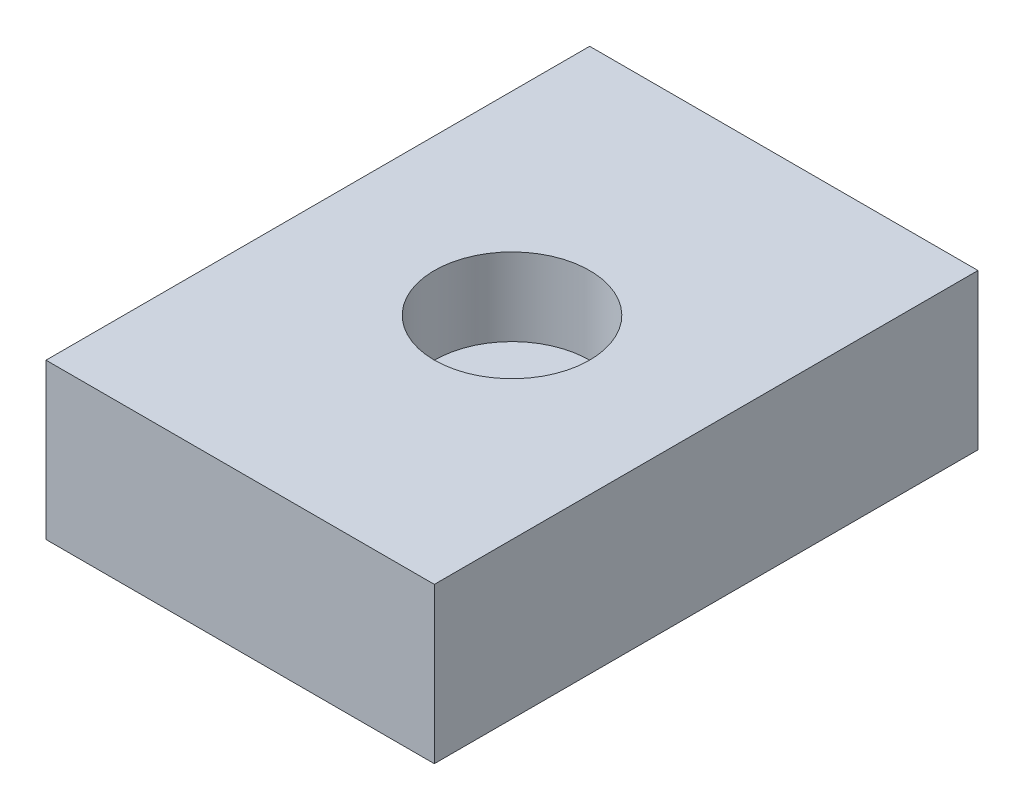
ISO-10303-21;
HEADER;
FILE_DESCRIPTION(('STEP AP214'),'2;1');
FILE_NAME('part.step','',(''),(''),'','','');
FILE_SCHEMA(('AUTOMOTIVE_DESIGN { 1 0 10303 214 1 1 1 1 }'));
ENDSEC;
DATA;
#1=APPLICATION_CONTEXT('core data for automotive mechanical design processes');
#2=APPLICATION_PROTOCOL_DEFINITION('international standard','automotive_design',2000,#1);
#3=PRODUCT_CONTEXT('',#1,'mechanical');
#4=PRODUCT('Part','Part','',(#3));
#5=PRODUCT_RELATED_PRODUCT_CATEGORY('part','',(#4));
#6=PRODUCT_DEFINITION_FORMATION('','',#4);
#7=PRODUCT_DEFINITION_CONTEXT('part definition',#1,'design');
#8=PRODUCT_DEFINITION('design','',#6,#7);
#9=PRODUCT_DEFINITION_SHAPE('','',#8);
#10=(LENGTH_UNIT() NAMED_UNIT(*) SI_UNIT(.MILLI.,.METRE.));
#11=(NAMED_UNIT(*) PLANE_ANGLE_UNIT() SI_UNIT($,.RADIAN.));
#12=(NAMED_UNIT(*) SI_UNIT($,.STERADIAN.) SOLID_ANGLE_UNIT());
#13=UNCERTAINTY_MEASURE_WITH_UNIT(LENGTH_MEASURE(1.E-05),#10,'distance_accuracy_value','');
#14=(GEOMETRIC_REPRESENTATION_CONTEXT(3) GLOBAL_UNCERTAINTY_ASSIGNED_CONTEXT((#13)) GLOBAL_UNIT_ASSIGNED_CONTEXT((#10,
#11,#12)) REPRESENTATION_CONTEXT('',''));
#15=CARTESIAN_POINT('',(0.,0.,0.));
#16=DIRECTION('',(0.,0.,1.));
#17=DIRECTION('',(1.,0.,0.));
#18=AXIS2_PLACEMENT_3D('',#15,#16,#17);
#19=CARTESIAN_POINT('',(-31.75,25.4,-44.45));
#20=DIRECTION('',(0.,0.,-1.));
#21=DIRECTION('',(-1.,0.,0.));
#22=AXIS2_PLACEMENT_3D('',#19,#20,#21);
#23=PLANE('',#22);
#24=DIRECTION('',(1.,0.,0.));
#25=VECTOR('',#24,1.);
#26=CARTESIAN_POINT('',(-31.75,0.,-44.45));
#27=LINE('',#26,#25);
#28=CARTESIAN_POINT('',(-31.75,0.,-44.45));
#29=VERTEX_POINT('',#28);
#30=CARTESIAN_POINT('',(31.75,0.,-44.45));
#31=VERTEX_POINT('',#30);
#32=EDGE_CURVE('E109',#29,#31,#27,.T.);
#33=ORIENTED_EDGE('',*,*,#32,.F.);
#34=DIRECTION('',(0.,-1.,0.));
#35=VECTOR('',#34,1.);
#36=CARTESIAN_POINT('',(-31.75,25.4,-44.45));
#37=LINE('',#36,#35);
#38=CARTESIAN_POINT('',(-31.75,25.4,-44.45));
#39=VERTEX_POINT('',#38);
#40=EDGE_CURVE('E11',#39,#29,#37,.T.);
#41=ORIENTED_EDGE('',*,*,#40,.F.);
#42=DIRECTION('',(1.,0.,0.));
#43=VECTOR('',#42,1.);
#44=CARTESIAN_POINT('',(-31.75,25.4,-44.45));
#45=LINE('',#44,#43);
#46=CARTESIAN_POINT('',(31.75,25.4,-44.45));
#47=VERTEX_POINT('',#46);
#48=EDGE_CURVE('E102',#39,#47,#45,.T.);
#49=ORIENTED_EDGE('',*,*,#48,.T.);
#50=DIRECTION('',(0.,-1.,0.));
#51=VECTOR('',#50,1.);
#52=CARTESIAN_POINT('',(31.75,25.4,-44.45));
#53=LINE('',#52,#51);
#54=EDGE_CURVE('E50',#47,#31,#53,.T.);
#55=ORIENTED_EDGE('',*,*,#54,.T.);
#56=EDGE_LOOP('',(#33,#41,#49,#55));
#57=FACE_BOUND('',#56,.T.);
#58=ADVANCED_FACE('F42',(#57),#23,.T.);
#59=CARTESIAN_POINT('',(-31.75,25.4,-44.45));
#60=DIRECTION('',(1.,0.,0.));
#61=DIRECTION('',(0.,0.,-1.));
#62=AXIS2_PLACEMENT_3D('',#59,#60,#61);
#63=PLANE('',#62);
#64=DIRECTION('',(0.,0.,1.));
#65=VECTOR('',#64,1.);
#66=CARTESIAN_POINT('',(-31.75,0.,-44.45));
#67=LINE('',#66,#65);
#68=CARTESIAN_POINT('',(-31.75,0.,44.45));
#69=VERTEX_POINT('',#68);
#70=EDGE_CURVE('E76',#29,#69,#67,.T.);
#71=ORIENTED_EDGE('',*,*,#70,.T.);
#72=DIRECTION('',(0.,-1.,0.));
#73=VECTOR('',#72,1.);
#74=CARTESIAN_POINT('',(-31.75,25.4,44.45));
#75=LINE('',#74,#73);
#76=CARTESIAN_POINT('',(-31.75,25.4,44.45));
#77=VERTEX_POINT('',#76);
#78=EDGE_CURVE('E52',#77,#69,#75,.T.);
#79=ORIENTED_EDGE('',*,*,#78,.F.);
#80=DIRECTION('',(0.,0.,1.));
#81=VECTOR('',#80,1.);
#82=CARTESIAN_POINT('',(-31.75,25.4,-44.45));
#83=LINE('',#82,#81);
#84=EDGE_CURVE('E94',#39,#77,#83,.T.);
#85=ORIENTED_EDGE('',*,*,#84,.F.);
#86=ORIENTED_EDGE('',*,*,#40,.T.);
#87=EDGE_LOOP('',(#71,#79,#85,#86));
#88=FACE_BOUND('',#87,.T.);
#89=ADVANCED_FACE('F122',(#88),#63,.F.);
#90=CARTESIAN_POINT('',(-31.75,25.4,44.45));
#91=DIRECTION('',(0.,0.,-1.));
#92=DIRECTION('',(-1.,0.,0.));
#93=AXIS2_PLACEMENT_3D('',#90,#91,#92);
#94=PLANE('',#93);
#95=DIRECTION('',(1.,0.,0.));
#96=VECTOR('',#95,1.);
#97=CARTESIAN_POINT('',(-31.75,0.,44.45));
#98=LINE('',#97,#96);
#99=CARTESIAN_POINT('',(31.75,0.,44.45));
#100=VERTEX_POINT('',#99);
#101=EDGE_CURVE('E101',#69,#100,#98,.T.);
#102=ORIENTED_EDGE('',*,*,#101,.T.);
#103=DIRECTION('',(0.,-1.,0.));
#104=VECTOR('',#103,1.);
#105=CARTESIAN_POINT('',(31.75,25.4,44.45));
#106=LINE('',#105,#104);
#107=CARTESIAN_POINT('',(31.75,25.4,44.45));
#108=VERTEX_POINT('',#107);
#109=EDGE_CURVE('E98',#108,#100,#106,.T.);
#110=ORIENTED_EDGE('',*,*,#109,.F.);
#111=DIRECTION('',(1.,0.,0.));
#112=VECTOR('',#111,1.);
#113=CARTESIAN_POINT('',(-31.75,25.4,44.45));
#114=LINE('',#113,#112);
#115=EDGE_CURVE('E90',#77,#108,#114,.T.);
#116=ORIENTED_EDGE('',*,*,#115,.F.);
#117=ORIENTED_EDGE('',*,*,#78,.T.);
#118=EDGE_LOOP('',(#102,#110,#116,#117));
#119=FACE_BOUND('',#118,.T.);
#120=ADVANCED_FACE('F97',(#119),#94,.F.);
#121=CARTESIAN_POINT('',(31.75,25.4,-44.45));
#122=DIRECTION('',(1.,0.,0.));
#123=DIRECTION('',(0.,0.,-1.));
#124=AXIS2_PLACEMENT_3D('',#121,#122,#123);
#125=PLANE('',#124);
#126=DIRECTION('',(0.,0.,1.));
#127=VECTOR('',#126,1.);
#128=CARTESIAN_POINT('',(31.75,0.,-44.45));
#129=LINE('',#128,#127);
#130=EDGE_CURVE('E114',#31,#100,#129,.T.);
#131=ORIENTED_EDGE('',*,*,#130,.F.);
#132=ORIENTED_EDGE('',*,*,#54,.F.);
#133=DIRECTION('',(0.,0.,1.));
#134=VECTOR('',#133,1.);
#135=CARTESIAN_POINT('',(31.75,25.4,-44.45));
#136=LINE('',#135,#134);
#137=EDGE_CURVE('E91',#47,#108,#136,.T.);
#138=ORIENTED_EDGE('',*,*,#137,.T.);
#139=ORIENTED_EDGE('',*,*,#109,.T.);
#140=EDGE_LOOP('',(#131,#132,#138,#139));
#141=FACE_BOUND('',#140,.T.);
#142=ADVANCED_FACE('F103',(#141),#125,.T.);
#143=CARTESIAN_POINT('',(0.,25.4,0.));
#144=DIRECTION('',(0.,-1.,0.));
#145=DIRECTION('',(0.,0.,-1.));
#146=AXIS2_PLACEMENT_3D('',#143,#144,#145);
#147=PLANE('',#146);
#148=CARTESIAN_POINT('',(0.,25.4,0.));
#149=DIRECTION('',(0.,1.,0.));
#150=DIRECTION('',(0.,0.,1.));
#151=AXIS2_PLACEMENT_3D('',#148,#149,#150);
#152=CIRCLE('',#151,12.7);
#153=CARTESIAN_POINT('',(0.,25.4,12.7));
#154=VERTEX_POINT('',#153);
#155=EDGE_CURVE('E153',#154,#154,#152,.T.);
#156=ORIENTED_EDGE('',*,*,#155,.F.);
#157=EDGE_LOOP('',(#156));
#158=FACE_BOUND('',#157,.T.);
#159=ORIENTED_EDGE('',*,*,#48,.F.);
#160=ORIENTED_EDGE('',*,*,#84,.T.);
#161=ORIENTED_EDGE('',*,*,#115,.T.);
#162=ORIENTED_EDGE('',*,*,#137,.F.);
#163=EDGE_LOOP('',(#159,#160,#161,#162));
#164=FACE_BOUND('',#163,.T.);
#165=ADVANCED_FACE('F95',(#158,#164),#147,.F.);
#166=CARTESIAN_POINT('',(0.,0.,0.));
#167=DIRECTION('',(0.,-1.,0.));
#168=DIRECTION('',(0.,0.,-1.));
#169=AXIS2_PLACEMENT_3D('',#166,#167,#168);
#170=PLANE('',#169);
#171=ORIENTED_EDGE('',*,*,#32,.T.);
#172=ORIENTED_EDGE('',*,*,#130,.T.);
#173=ORIENTED_EDGE('',*,*,#101,.F.);
#174=ORIENTED_EDGE('',*,*,#70,.F.);
#175=EDGE_LOOP('',(#171,#172,#173,#174));
#176=FACE_BOUND('',#175,.T.);
#177=ADVANCED_FACE('F118',(#176),#170,.T.);
#178=CARTESIAN_POINT('',(0.,12.7,0.));
#179=DIRECTION('',(0.,1.,0.));
#180=DIRECTION('',(0.,0.,1.));
#181=AXIS2_PLACEMENT_3D('',#178,#179,#180);
#182=CYLINDRICAL_SURFACE('',#181,12.7);
#183=CARTESIAN_POINT('',(0.,12.7,0.));
#184=DIRECTION('',(0.,1.,0.));
#185=DIRECTION('',(0.,0.,1.));
#186=AXIS2_PLACEMENT_3D('',#183,#184,#185);
#187=CIRCLE('',#186,12.7);
#188=CARTESIAN_POINT('',(0.,12.7,12.7));
#189=VERTEX_POINT('',#188);
#190=EDGE_CURVE('E111',#189,#189,#187,.T.);
#191=ORIENTED_EDGE('',*,*,#190,.F.);
#192=EDGE_LOOP('',(#191));
#193=FACE_BOUND('',#192,.T.);
#194=ORIENTED_EDGE('',*,*,#155,.T.);
#195=EDGE_LOOP('',(#194));
#196=FACE_BOUND('',#195,.T.);
#197=ADVANCED_FACE('F143',(#193,#196),#182,.F.);
#198=CARTESIAN_POINT('',(0.,12.7,0.));
#199=DIRECTION('',(0.,1.,0.));
#200=DIRECTION('',(0.,0.,1.));
#201=AXIS2_PLACEMENT_3D('',#198,#199,#200);
#202=PLANE('',#201);
#203=ORIENTED_EDGE('',*,*,#190,.T.);
#204=EDGE_LOOP('',(#203));
#205=FACE_BOUND('',#204,.T.);
#206=ADVANCED_FACE('F144',(#205),#202,.T.);
#207=CLOSED_SHELL('',(#58,#89,#120,#142,#165,#177,#197,#206));
#208=MANIFOLD_SOLID_BREP('B2',#207);
#209=ADVANCED_BREP_SHAPE_REPRESENTATION('',(#18,#208),#14);
#210=SHAPE_DEFINITION_REPRESENTATION(#9,#209);
ENDSEC;
END-ISO-10303-21;
